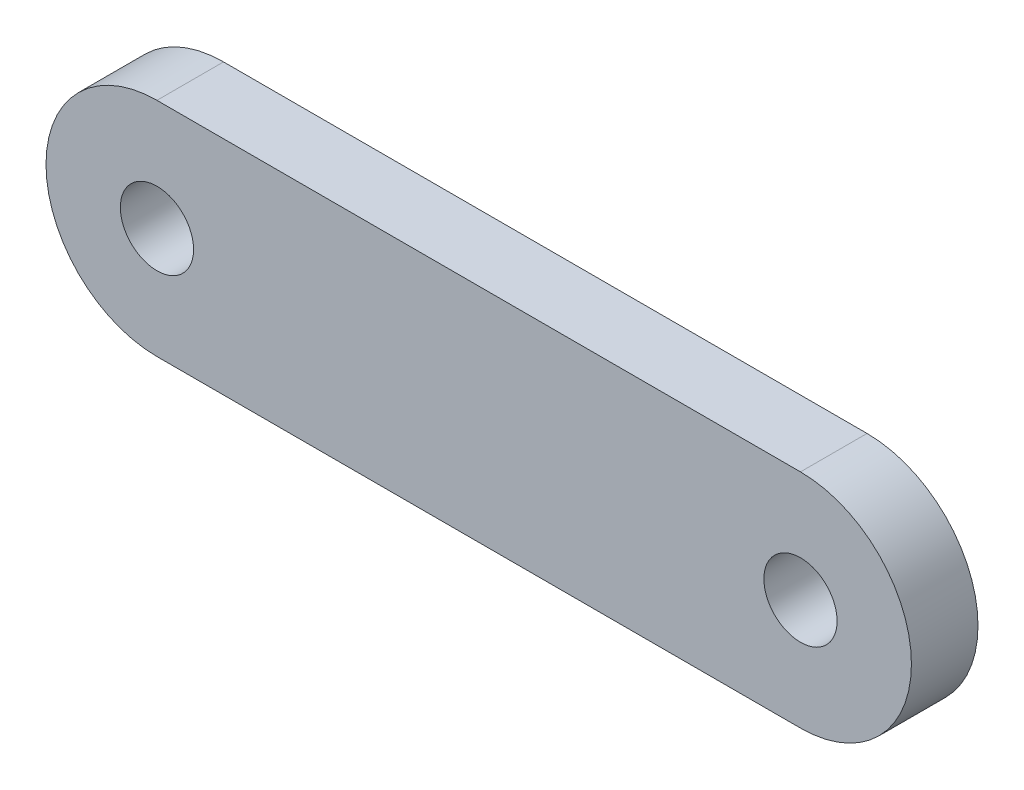
ISO-10303-21;
HEADER;
FILE_DESCRIPTION(('STEP AP214'),'2;1');
FILE_NAME('part.step','',(''),(''),'','','');
FILE_SCHEMA(('AUTOMOTIVE_DESIGN { 1 0 10303 214 1 1 1 1 }'));
ENDSEC;
DATA;
#1=APPLICATION_CONTEXT('core data for automotive mechanical design processes');
#2=APPLICATION_PROTOCOL_DEFINITION('international standard','automotive_design',2000,#1);
#3=PRODUCT_CONTEXT('',#1,'mechanical');
#4=PRODUCT('Part','Part','',(#3));
#5=PRODUCT_RELATED_PRODUCT_CATEGORY('part','',(#4));
#6=PRODUCT_DEFINITION_FORMATION('','',#4);
#7=PRODUCT_DEFINITION_CONTEXT('part definition',#1,'design');
#8=PRODUCT_DEFINITION('design','',#6,#7);
#9=PRODUCT_DEFINITION_SHAPE('','',#8);
#10=(LENGTH_UNIT() NAMED_UNIT(*) SI_UNIT(.MILLI.,.METRE.));
#11=(NAMED_UNIT(*) PLANE_ANGLE_UNIT() SI_UNIT($,.RADIAN.));
#12=(NAMED_UNIT(*) SI_UNIT($,.STERADIAN.) SOLID_ANGLE_UNIT());
#13=UNCERTAINTY_MEASURE_WITH_UNIT(LENGTH_MEASURE(1.E-05),#10,'distance_accuracy_value','');
#14=(GEOMETRIC_REPRESENTATION_CONTEXT(3) GLOBAL_UNCERTAINTY_ASSIGNED_CONTEXT((#13)) GLOBAL_UNIT_ASSIGNED_CONTEXT((#10,
#11,#12)) REPRESENTATION_CONTEXT('',''));
#15=CARTESIAN_POINT('',(0.,0.,0.));
#16=DIRECTION('',(0.,0.,1.));
#17=DIRECTION('',(1.,0.,0.));
#18=AXIS2_PLACEMENT_3D('',#15,#16,#17);
#19=CARTESIAN_POINT('',(0.,-5.,3.));
#20=DIRECTION('',(0.,0.,1.));
#21=DIRECTION('',(1.,0.,0.));
#22=AXIS2_PLACEMENT_3D('',#19,#20,#21);
#23=PLANE('',#22);
#24=CARTESIAN_POINT('',(0.,-5.,3.));
#25=DIRECTION('',(0.,0.,1.));
#26=DIRECTION('',(1.,0.,0.));
#27=AXIS2_PLACEMENT_3D('',#24,#25,#26);
#28=CIRCLE('',#27,1.65);
#29=CARTESIAN_POINT('',(1.65,-5.,3.));
#30=VERTEX_POINT('',#29);
#31=EDGE_CURVE('E102',#30,#30,#28,.T.);
#32=ORIENTED_EDGE('',*,*,#31,.F.);
#33=EDGE_LOOP('',(#32));
#34=FACE_BOUND('',#33,.T.);
#35=CARTESIAN_POINT('',(0.,-5.,3.));
#36=DIRECTION('',(0.,0.,1.));
#37=DIRECTION('',(1.,0.,0.));
#38=AXIS2_PLACEMENT_3D('',#35,#36,#37);
#39=CIRCLE('',#38,5.);
#40=CARTESIAN_POINT('',(0.,0.,3.));
#41=VERTEX_POINT('',#40);
#42=CARTESIAN_POINT('',(0.,-10.,3.));
#43=VERTEX_POINT('',#42);
#44=EDGE_CURVE('E87',#41,#43,#39,.T.);
#45=ORIENTED_EDGE('',*,*,#44,.T.);
#46=DIRECTION('',(1.,0.,0.));
#47=VECTOR('',#46,1.);
#48=CARTESIAN_POINT('',(0.,-10.,3.));
#49=LINE('',#48,#47);
#50=CARTESIAN_POINT('',(29.,-10.,3.));
#51=VERTEX_POINT('',#50);
#52=EDGE_CURVE('E82',#43,#51,#49,.T.);
#53=ORIENTED_EDGE('',*,*,#52,.T.);
#54=CARTESIAN_POINT('',(29.,-5.,3.));
#55=DIRECTION('',(0.,0.,1.));
#56=DIRECTION('',(-1.,0.,0.));
#57=AXIS2_PLACEMENT_3D('',#54,#55,#56);
#58=CIRCLE('',#57,5.);
#59=CARTESIAN_POINT('',(29.,0.,3.));
#60=VERTEX_POINT('',#59);
#61=EDGE_CURVE('E85',#51,#60,#58,.T.);
#62=ORIENTED_EDGE('',*,*,#61,.T.);
#63=DIRECTION('',(-1.,0.,0.));
#64=VECTOR('',#63,1.);
#65=CARTESIAN_POINT('',(0.,0.,3.));
#66=LINE('',#65,#64);
#67=EDGE_CURVE('E52',#60,#41,#66,.T.);
#68=ORIENTED_EDGE('',*,*,#67,.T.);
#69=EDGE_LOOP('',(#45,#53,#62,#68));
#70=FACE_BOUND('',#69,.T.);
#71=CARTESIAN_POINT('',(29.,-5.,3.));
#72=DIRECTION('',(0.,0.,1.));
#73=DIRECTION('',(1.,0.,0.));
#74=AXIS2_PLACEMENT_3D('',#71,#72,#73);
#75=CIRCLE('',#74,1.65);
#76=CARTESIAN_POINT('',(30.65,-5.,3.));
#77=VERTEX_POINT('',#76);
#78=EDGE_CURVE('E117',#77,#77,#75,.T.);
#79=ORIENTED_EDGE('',*,*,#78,.F.);
#80=EDGE_LOOP('',(#79));
#81=FACE_BOUND('',#80,.T.);
#82=ADVANCED_FACE('F35',(#34,#70,#81),#23,.T.);
#83=CARTESIAN_POINT('',(0.,-5.,0.));
#84=DIRECTION('',(0.,0.,1.));
#85=DIRECTION('',(1.,0.,0.));
#86=AXIS2_PLACEMENT_3D('',#83,#84,#85);
#87=PLANE('',#86);
#88=CARTESIAN_POINT('',(0.,-5.,0.));
#89=DIRECTION('',(0.,0.,1.));
#90=DIRECTION('',(1.,0.,0.));
#91=AXIS2_PLACEMENT_3D('',#88,#89,#90);
#92=CIRCLE('',#91,5.);
#93=CARTESIAN_POINT('',(0.,0.,0.));
#94=VERTEX_POINT('',#93);
#95=CARTESIAN_POINT('',(0.,-10.,0.));
#96=VERTEX_POINT('',#95);
#97=EDGE_CURVE('E99',#94,#96,#92,.T.);
#98=ORIENTED_EDGE('',*,*,#97,.F.);
#99=DIRECTION('',(-1.,0.,0.));
#100=VECTOR('',#99,1.);
#101=CARTESIAN_POINT('',(0.,0.,0.));
#102=LINE('',#101,#100);
#103=CARTESIAN_POINT('',(29.,0.,0.));
#104=VERTEX_POINT('',#103);
#105=EDGE_CURVE('E75',#104,#94,#102,.T.);
#106=ORIENTED_EDGE('',*,*,#105,.F.);
#107=CARTESIAN_POINT('',(29.,-5.,0.));
#108=DIRECTION('',(0.,0.,1.));
#109=DIRECTION('',(-1.,0.,0.));
#110=AXIS2_PLACEMENT_3D('',#107,#108,#109);
#111=CIRCLE('',#110,5.);
#112=CARTESIAN_POINT('',(29.,-10.,0.));
#113=VERTEX_POINT('',#112);
#114=EDGE_CURVE('E69',#113,#104,#111,.T.);
#115=ORIENTED_EDGE('',*,*,#114,.F.);
#116=DIRECTION('',(1.,0.,0.));
#117=VECTOR('',#116,1.);
#118=CARTESIAN_POINT('',(0.,-10.,0.));
#119=LINE('',#118,#117);
#120=EDGE_CURVE('E91',#96,#113,#119,.T.);
#121=ORIENTED_EDGE('',*,*,#120,.F.);
#122=EDGE_LOOP('',(#98,#106,#115,#121));
#123=FACE_BOUND('',#122,.T.);
#124=CARTESIAN_POINT('',(0.,-5.,0.));
#125=DIRECTION('',(0.,0.,1.));
#126=DIRECTION('',(1.,0.,0.));
#127=AXIS2_PLACEMENT_3D('',#124,#125,#126);
#128=CIRCLE('',#127,1.65);
#129=CARTESIAN_POINT('',(1.65,-5.,0.));
#130=VERTEX_POINT('',#129);
#131=EDGE_CURVE('E114',#130,#130,#128,.T.);
#132=ORIENTED_EDGE('',*,*,#131,.T.);
#133=EDGE_LOOP('',(#132));
#134=FACE_BOUND('',#133,.T.);
#135=CARTESIAN_POINT('',(29.,-5.,0.));
#136=DIRECTION('',(0.,0.,1.));
#137=DIRECTION('',(1.,0.,0.));
#138=AXIS2_PLACEMENT_3D('',#135,#136,#137);
#139=CIRCLE('',#138,1.65);
#140=CARTESIAN_POINT('',(30.65,-5.,0.));
#141=VERTEX_POINT('',#140);
#142=EDGE_CURVE('E120',#141,#141,#139,.T.);
#143=ORIENTED_EDGE('',*,*,#142,.T.);
#144=EDGE_LOOP('',(#143));
#145=FACE_BOUND('',#144,.T.);
#146=ADVANCED_FACE('F110',(#123,#134,#145),#87,.F.);
#147=CARTESIAN_POINT('',(0.,-5.,3.));
#148=DIRECTION('',(0.,0.,-1.));
#149=DIRECTION('',(-1.,0.,0.));
#150=AXIS2_PLACEMENT_3D('',#147,#148,#149);
#151=CYLINDRICAL_SURFACE('',#150,5.);
#152=ORIENTED_EDGE('',*,*,#97,.T.);
#153=DIRECTION('',(0.,0.,-1.));
#154=VECTOR('',#153,1.);
#155=CARTESIAN_POINT('',(0.,-10.,3.));
#156=LINE('',#155,#154);
#157=EDGE_CURVE('E11',#43,#96,#156,.T.);
#158=ORIENTED_EDGE('',*,*,#157,.F.);
#159=ORIENTED_EDGE('',*,*,#44,.F.);
#160=DIRECTION('',(0.,0.,-1.));
#161=VECTOR('',#160,1.);
#162=CARTESIAN_POINT('',(0.,0.,3.));
#163=LINE('',#162,#161);
#164=EDGE_CURVE('E95',#41,#94,#163,.T.);
#165=ORIENTED_EDGE('',*,*,#164,.T.);
#166=EDGE_LOOP('',(#152,#158,#159,#165));
#167=FACE_BOUND('',#166,.T.);
#168=ADVANCED_FACE('F37',(#167),#151,.T.);
#169=CARTESIAN_POINT('',(0.,-10.,3.));
#170=DIRECTION('',(0.,1.,0.));
#171=DIRECTION('',(0.,0.,1.));
#172=AXIS2_PLACEMENT_3D('',#169,#170,#171);
#173=PLANE('',#172);
#174=ORIENTED_EDGE('',*,*,#120,.T.);
#175=DIRECTION('',(0.,0.,-1.));
#176=VECTOR('',#175,1.);
#177=CARTESIAN_POINT('',(29.,-10.,3.));
#178=LINE('',#177,#176);
#179=EDGE_CURVE('E44',#51,#113,#178,.T.);
#180=ORIENTED_EDGE('',*,*,#179,.F.);
#181=ORIENTED_EDGE('',*,*,#52,.F.);
#182=ORIENTED_EDGE('',*,*,#157,.T.);
#183=EDGE_LOOP('',(#174,#180,#181,#182));
#184=FACE_BOUND('',#183,.T.);
#185=ADVANCED_FACE('F90',(#184),#173,.F.);
#186=CARTESIAN_POINT('',(29.,-5.,3.));
#187=DIRECTION('',(0.,0.,-1.));
#188=DIRECTION('',(-1.,0.,0.));
#189=AXIS2_PLACEMENT_3D('',#186,#187,#188);
#190=CYLINDRICAL_SURFACE('',#189,5.);
#191=ORIENTED_EDGE('',*,*,#114,.T.);
#192=DIRECTION('',(0.,0.,-1.));
#193=VECTOR('',#192,1.);
#194=CARTESIAN_POINT('',(29.,0.,3.));
#195=LINE('',#194,#193);
#196=EDGE_CURVE('E92',#60,#104,#195,.T.);
#197=ORIENTED_EDGE('',*,*,#196,.F.);
#198=ORIENTED_EDGE('',*,*,#61,.F.);
#199=ORIENTED_EDGE('',*,*,#179,.T.);
#200=EDGE_LOOP('',(#191,#197,#198,#199));
#201=FACE_BOUND('',#200,.T.);
#202=ADVANCED_FACE('F93',(#201),#190,.T.);
#203=CARTESIAN_POINT('',(0.,0.,3.));
#204=DIRECTION('',(0.,-1.,0.));
#205=DIRECTION('',(0.,0.,-1.));
#206=AXIS2_PLACEMENT_3D('',#203,#204,#205);
#207=PLANE('',#206);
#208=ORIENTED_EDGE('',*,*,#105,.T.);
#209=ORIENTED_EDGE('',*,*,#164,.F.);
#210=ORIENTED_EDGE('',*,*,#67,.F.);
#211=ORIENTED_EDGE('',*,*,#196,.T.);
#212=EDGE_LOOP('',(#208,#209,#210,#211));
#213=FACE_BOUND('',#212,.T.);
#214=ADVANCED_FACE('F107',(#213),#207,.F.);
#215=CARTESIAN_POINT('',(0.,-5.,3.));
#216=DIRECTION('',(0.,0.,-1.));
#217=DIRECTION('',(-1.,0.,0.));
#218=AXIS2_PLACEMENT_3D('',#215,#216,#217);
#219=CYLINDRICAL_SURFACE('',#218,1.65);
#220=ORIENTED_EDGE('',*,*,#31,.T.);
#221=EDGE_LOOP('',(#220));
#222=FACE_BOUND('',#221,.T.);
#223=ORIENTED_EDGE('',*,*,#131,.F.);
#224=EDGE_LOOP('',(#223));
#225=FACE_BOUND('',#224,.T.);
#226=ADVANCED_FACE('F137',(#222,#225),#219,.F.);
#227=CARTESIAN_POINT('',(29.,-5.,3.));
#228=DIRECTION('',(0.,0.,-1.));
#229=DIRECTION('',(-1.,0.,0.));
#230=AXIS2_PLACEMENT_3D('',#227,#228,#229);
#231=CYLINDRICAL_SURFACE('',#230,1.65);
#232=ORIENTED_EDGE('',*,*,#78,.T.);
#233=EDGE_LOOP('',(#232));
#234=FACE_BOUND('',#233,.T.);
#235=ORIENTED_EDGE('',*,*,#142,.F.);
#236=EDGE_LOOP('',(#235));
#237=FACE_BOUND('',#236,.T.);
#238=ADVANCED_FACE('F126',(#234,#237),#231,.F.);
#239=CLOSED_SHELL('',(#82,#146,#168,#185,#202,#214,#226,#238));
#240=MANIFOLD_SOLID_BREP('B2',#239);
#241=ADVANCED_BREP_SHAPE_REPRESENTATION('',(#18,#240),#14);
#242=SHAPE_DEFINITION_REPRESENTATION(#9,#241);
ENDSEC;
END-ISO-10303-21;
